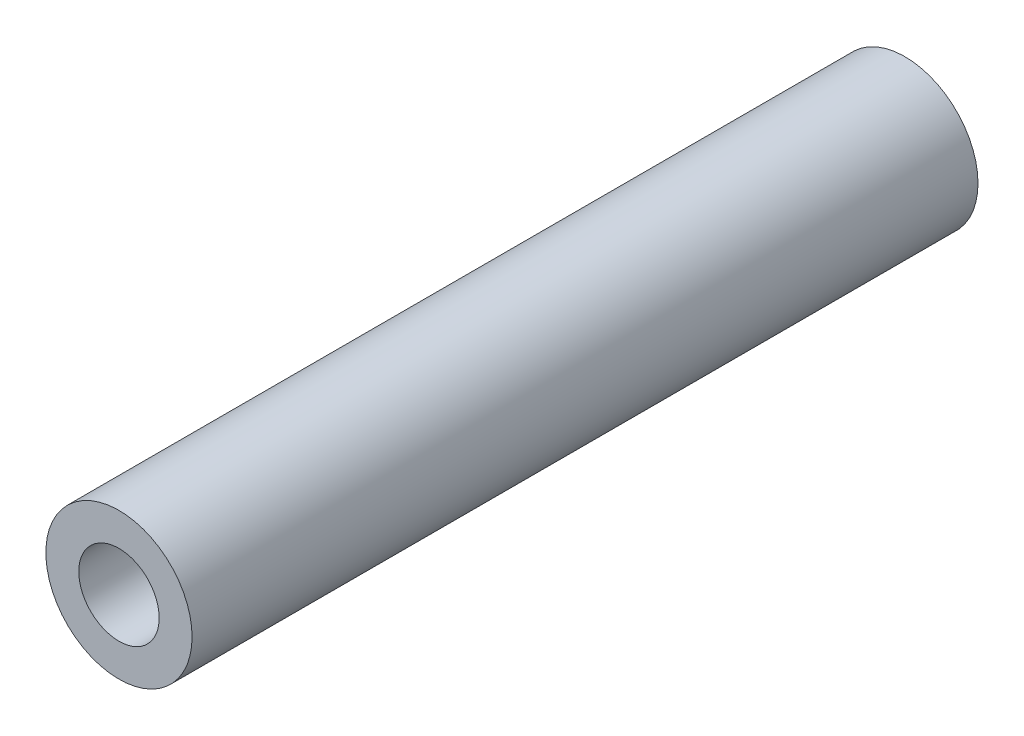
ISO-10303-21;
HEADER;
FILE_DESCRIPTION(('STEP AP214'),'2;1');
FILE_NAME('part.step','',(''),(''),'','','');
FILE_SCHEMA(('AUTOMOTIVE_DESIGN { 1 0 10303 214 1 1 1 1 }'));
ENDSEC;
DATA;
#1=APPLICATION_CONTEXT('core data for automotive mechanical design processes');
#2=APPLICATION_PROTOCOL_DEFINITION('international standard','automotive_design',2000,#1);
#3=PRODUCT_CONTEXT('',#1,'mechanical');
#4=PRODUCT('Part','Part','',(#3));
#5=PRODUCT_RELATED_PRODUCT_CATEGORY('part','',(#4));
#6=PRODUCT_DEFINITION_FORMATION('','',#4);
#7=PRODUCT_DEFINITION_CONTEXT('part definition',#1,'design');
#8=PRODUCT_DEFINITION('design','',#6,#7);
#9=PRODUCT_DEFINITION_SHAPE('','',#8);
#10=(LENGTH_UNIT() NAMED_UNIT(*) SI_UNIT(.MILLI.,.METRE.));
#11=(NAMED_UNIT(*) PLANE_ANGLE_UNIT() SI_UNIT($,.RADIAN.));
#12=(NAMED_UNIT(*) SI_UNIT($,.STERADIAN.) SOLID_ANGLE_UNIT());
#13=UNCERTAINTY_MEASURE_WITH_UNIT(LENGTH_MEASURE(1.E-05),#10,'distance_accuracy_value','');
#14=(GEOMETRIC_REPRESENTATION_CONTEXT(3) GLOBAL_UNCERTAINTY_ASSIGNED_CONTEXT((#13)) GLOBAL_UNIT_ASSIGNED_CONTEXT((#10,
#11,#12)) REPRESENTATION_CONTEXT('',''));
#15=CARTESIAN_POINT('',(0.,0.,0.));
#16=DIRECTION('',(0.,0.,1.));
#17=DIRECTION('',(1.,0.,0.));
#18=AXIS2_PLACEMENT_3D('',#15,#16,#17);
#19=CARTESIAN_POINT('',(0.,0.,43.));
#20=DIRECTION('',(0.,0.,1.));
#21=DIRECTION('',(1.,0.,0.));
#22=AXIS2_PLACEMENT_3D('',#19,#20,#21);
#23=PLANE('',#22);
#24=CARTESIAN_POINT('',(0.,0.,43.));
#25=DIRECTION('',(0.,0.,1.));
#26=DIRECTION('',(1.,0.,0.));
#27=AXIS2_PLACEMENT_3D('',#24,#25,#26);
#28=CIRCLE('',#27,4.);
#29=CARTESIAN_POINT('',(4.,0.,43.));
#30=VERTEX_POINT('',#29);
#31=EDGE_CURVE('E10',#30,#30,#28,.T.);
#32=ORIENTED_EDGE('',*,*,#31,.T.);
#33=EDGE_LOOP('',(#32));
#34=FACE_BOUND('',#33,.T.);
#35=CARTESIAN_POINT('',(0.,0.,43.));
#36=DIRECTION('',(0.,0.,1.));
#37=DIRECTION('',(1.,0.,0.));
#38=AXIS2_PLACEMENT_3D('',#35,#36,#37);
#39=CIRCLE('',#38,2.2);
#40=CARTESIAN_POINT('',(2.2,0.,43.));
#41=VERTEX_POINT('',#40);
#42=EDGE_CURVE('E56',#41,#41,#39,.T.);
#43=ORIENTED_EDGE('',*,*,#42,.F.);
#44=EDGE_LOOP('',(#43));
#45=FACE_BOUND('',#44,.T.);
#46=ADVANCED_FACE('F43',(#34,#45),#23,.T.);
#47=CARTESIAN_POINT('',(0.,0.,0.));
#48=DIRECTION('',(0.,0.,1.));
#49=DIRECTION('',(1.,0.,0.));
#50=AXIS2_PLACEMENT_3D('',#47,#48,#49);
#51=PLANE('',#50);
#52=CARTESIAN_POINT('',(0.,0.,0.));
#53=DIRECTION('',(0.,0.,1.));
#54=DIRECTION('',(1.,0.,0.));
#55=AXIS2_PLACEMENT_3D('',#52,#53,#54);
#56=CIRCLE('',#55,4.);
#57=CARTESIAN_POINT('',(4.,0.,0.));
#58=VERTEX_POINT('',#57);
#59=EDGE_CURVE('E47',#58,#58,#56,.T.);
#60=ORIENTED_EDGE('',*,*,#59,.F.);
#61=EDGE_LOOP('',(#60));
#62=FACE_BOUND('',#61,.T.);
#63=CARTESIAN_POINT('',(0.,0.,0.));
#64=DIRECTION('',(0.,0.,1.));
#65=DIRECTION('',(1.,0.,0.));
#66=AXIS2_PLACEMENT_3D('',#63,#64,#65);
#67=CIRCLE('',#66,2.2);
#68=CARTESIAN_POINT('',(2.2,0.,0.));
#69=VERTEX_POINT('',#68);
#70=EDGE_CURVE('E58',#69,#69,#67,.T.);
#71=ORIENTED_EDGE('',*,*,#70,.T.);
#72=EDGE_LOOP('',(#71));
#73=FACE_BOUND('',#72,.T.);
#74=ADVANCED_FACE('F70',(#62,#73),#51,.F.);
#75=CARTESIAN_POINT('',(0.,0.,43.));
#76=DIRECTION('',(0.,0.,-1.));
#77=DIRECTION('',(-1.,0.,0.));
#78=AXIS2_PLACEMENT_3D('',#75,#76,#77);
#79=CYLINDRICAL_SURFACE('',#78,4.);
#80=ORIENTED_EDGE('',*,*,#31,.F.);
#81=EDGE_LOOP('',(#80));
#82=FACE_BOUND('',#81,.T.);
#83=ORIENTED_EDGE('',*,*,#59,.T.);
#84=EDGE_LOOP('',(#83));
#85=FACE_BOUND('',#84,.T.);
#86=ADVANCED_FACE('F45',(#82,#85),#79,.T.);
#87=CARTESIAN_POINT('',(0.,0.,43.));
#88=DIRECTION('',(0.,0.,-1.));
#89=DIRECTION('',(-1.,0.,0.));
#90=AXIS2_PLACEMENT_3D('',#87,#88,#89);
#91=CYLINDRICAL_SURFACE('',#90,2.2);
#92=ORIENTED_EDGE('',*,*,#42,.T.);
#93=EDGE_LOOP('',(#92));
#94=FACE_BOUND('',#93,.T.);
#95=ORIENTED_EDGE('',*,*,#70,.F.);
#96=EDGE_LOOP('',(#95));
#97=FACE_BOUND('',#96,.T.);
#98=ADVANCED_FACE('F66',(#94,#97),#91,.F.);
#99=CLOSED_SHELL('',(#46,#74,#86,#98));
#100=MANIFOLD_SOLID_BREP('B2',#99);
#101=ADVANCED_BREP_SHAPE_REPRESENTATION('',(#18,#100),#14);
#102=SHAPE_DEFINITION_REPRESENTATION(#9,#101);
ENDSEC;
END-ISO-10303-21;
